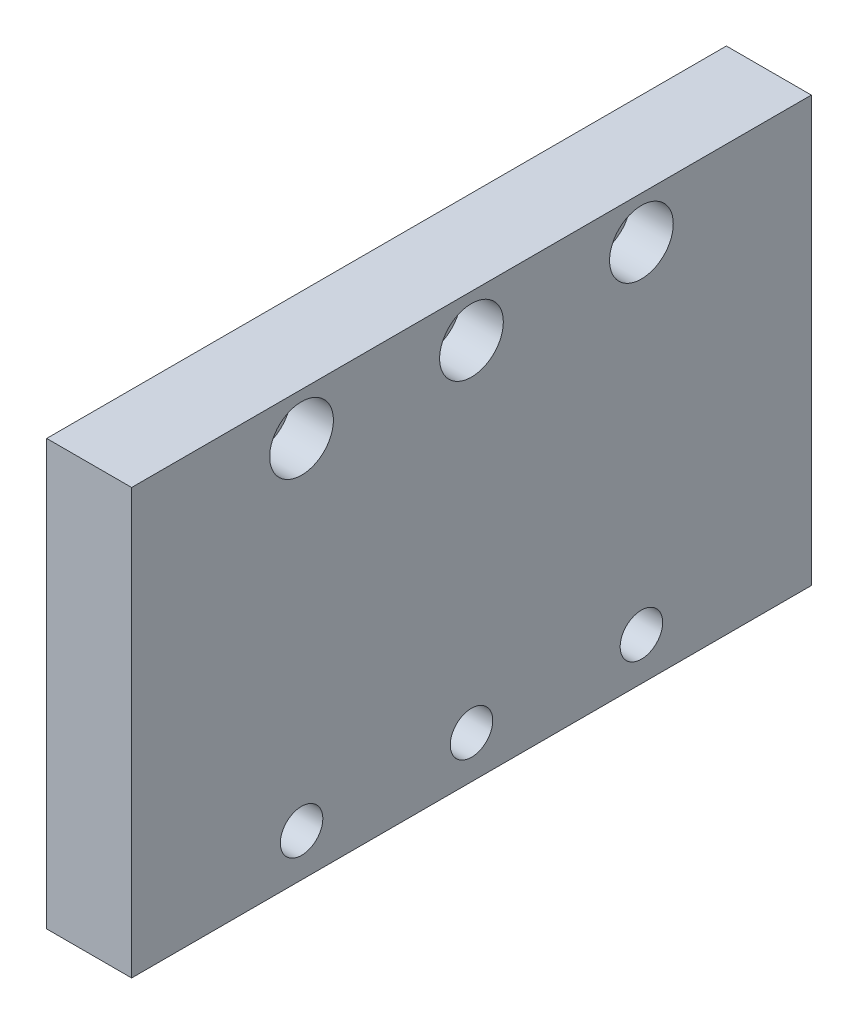
ISO-10303-21;
HEADER;
FILE_DESCRIPTION(('STEP AP214'),'2;1');
FILE_NAME('part.step','',(''),(''),'','','');
FILE_SCHEMA(('AUTOMOTIVE_DESIGN { 1 0 10303 214 1 1 1 1 }'));
ENDSEC;
DATA;
#1=APPLICATION_CONTEXT('core data for automotive mechanical design processes');
#2=APPLICATION_PROTOCOL_DEFINITION('international standard','automotive_design',2000,#1);
#3=PRODUCT_CONTEXT('',#1,'mechanical');
#4=PRODUCT('Part','Part','',(#3));
#5=PRODUCT_RELATED_PRODUCT_CATEGORY('part','',(#4));
#6=PRODUCT_DEFINITION_FORMATION('','',#4);
#7=PRODUCT_DEFINITION_CONTEXT('part definition',#1,'design');
#8=PRODUCT_DEFINITION('design','',#6,#7);
#9=PRODUCT_DEFINITION_SHAPE('','',#8);
#10=(LENGTH_UNIT() NAMED_UNIT(*) SI_UNIT(.MILLI.,.METRE.));
#11=(NAMED_UNIT(*) PLANE_ANGLE_UNIT() SI_UNIT($,.RADIAN.));
#12=(NAMED_UNIT(*) SI_UNIT($,.STERADIAN.) SOLID_ANGLE_UNIT());
#13=UNCERTAINTY_MEASURE_WITH_UNIT(LENGTH_MEASURE(1.E-05),#10,'distance_accuracy_value','');
#14=(GEOMETRIC_REPRESENTATION_CONTEXT(3) GLOBAL_UNCERTAINTY_ASSIGNED_CONTEXT((#13)) GLOBAL_UNIT_ASSIGNED_CONTEXT((#10,
#11,#12)) REPRESENTATION_CONTEXT('',''));
#15=CARTESIAN_POINT('',(0.,0.,0.));
#16=DIRECTION('',(0.,0.,1.));
#17=DIRECTION('',(1.,0.,0.));
#18=AXIS2_PLACEMENT_3D('',#15,#16,#17);
#19=CARTESIAN_POINT('',(-6.35,31.75,50.8));
#20=DIRECTION('',(0.,-1.,0.));
#21=DIRECTION('',(0.,0.,-1.));
#22=AXIS2_PLACEMENT_3D('',#19,#20,#21);
#23=PLANE('',#22);
#24=DIRECTION('',(-1.,0.,0.));
#25=VECTOR('',#24,1.);
#26=CARTESIAN_POINT('',(-6.35,31.75,-50.8));
#27=LINE('',#26,#25);
#28=CARTESIAN_POINT('',(6.35000000000004,31.75,-50.8));
#29=VERTEX_POINT('',#28);
#30=CARTESIAN_POINT('',(-6.35,31.75,-50.8));
#31=VERTEX_POINT('',#30);
#32=EDGE_CURVE('E87',#29,#31,#27,.T.);
#33=ORIENTED_EDGE('',*,*,#32,.T.);
#34=DIRECTION('',(0.,0.,-1.));
#35=VECTOR('',#34,1.);
#36=CARTESIAN_POINT('',(-6.35,31.75,50.8));
#37=LINE('',#36,#35);
#38=CARTESIAN_POINT('',(-6.35,31.75,50.8));
#39=VERTEX_POINT('',#38);
#40=EDGE_CURVE('E41',#39,#31,#37,.T.);
#41=ORIENTED_EDGE('',*,*,#40,.F.);
#42=DIRECTION('',(-1.,0.,0.));
#43=VECTOR('',#42,1.);
#44=CARTESIAN_POINT('',(-6.35,31.75,50.8));
#45=LINE('',#44,#43);
#46=CARTESIAN_POINT('',(6.35000000000004,31.75,50.8));
#47=VERTEX_POINT('',#46);
#48=EDGE_CURVE('E79',#47,#39,#45,.T.);
#49=ORIENTED_EDGE('',*,*,#48,.F.);
#50=DIRECTION('',(0.,0.,-1.));
#51=VECTOR('',#50,1.);
#52=CARTESIAN_POINT('',(6.35000000000004,31.75,50.8));
#53=LINE('',#52,#51);
#54=EDGE_CURVE('E11',#47,#29,#53,.T.);
#55=ORIENTED_EDGE('',*,*,#54,.T.);
#56=EDGE_LOOP('',(#33,#41,#49,#55));
#57=FACE_BOUND('',#56,.T.);
#58=ADVANCED_FACE('F33',(#57),#23,.F.);
#59=CARTESIAN_POINT('',(-6.35,19.05,50.8));
#60=DIRECTION('',(1.,0.,0.));
#61=DIRECTION('',(0.,1.,0.));
#62=AXIS2_PLACEMENT_3D('',#59,#60,#61);
#63=PLANE('',#62);
#64=CARTESIAN_POINT('',(-6.35000000000002,25.4,25.4));
#65=DIRECTION('',(1.,0.,0.));
#66=DIRECTION('',(0.,0.,-1.));
#67=AXIS2_PLACEMENT_3D('',#64,#65,#66);
#68=CIRCLE('',#67,3.175);
#69=CARTESIAN_POINT('',(-6.35000000000002,25.4,22.225));
#70=VERTEX_POINT('',#69);
#71=EDGE_CURVE('E131',#70,#70,#68,.T.);
#72=ORIENTED_EDGE('',*,*,#71,.T.);
#73=EDGE_LOOP('',(#72));
#74=FACE_BOUND('',#73,.T.);
#75=CARTESIAN_POINT('',(-6.35000000000002,25.4,0.));
#76=DIRECTION('',(1.,0.,0.));
#77=DIRECTION('',(0.,0.,-1.));
#78=AXIS2_PLACEMENT_3D('',#75,#76,#77);
#79=CIRCLE('',#78,3.175);
#80=CARTESIAN_POINT('',(-6.35000000000002,25.4,-3.175));
#81=VERTEX_POINT('',#80);
#82=EDGE_CURVE('E135',#81,#81,#79,.T.);
#83=ORIENTED_EDGE('',*,*,#82,.T.);
#84=EDGE_LOOP('',(#83));
#85=FACE_BOUND('',#84,.T.);
#86=CARTESIAN_POINT('',(-6.35000000000002,25.4,-25.4));
#87=DIRECTION('',(1.,0.,0.));
#88=DIRECTION('',(0.,0.,-1.));
#89=AXIS2_PLACEMENT_3D('',#86,#87,#88);
#90=CIRCLE('',#89,3.175);
#91=CARTESIAN_POINT('',(-6.35000000000002,25.4,-28.575));
#92=VERTEX_POINT('',#91);
#93=EDGE_CURVE('E139',#92,#92,#90,.T.);
#94=ORIENTED_EDGE('',*,*,#93,.T.);
#95=EDGE_LOOP('',(#94));
#96=FACE_BOUND('',#95,.T.);
#97=CARTESIAN_POINT('',(-6.35,-25.4,-25.4));
#98=DIRECTION('',(-1.,0.,0.));
#99=DIRECTION('',(0.,0.,1.));
#100=AXIS2_PLACEMENT_3D('',#97,#98,#99);
#101=CIRCLE('',#100,4.76249999999999);
#102=CARTESIAN_POINT('',(-6.35,-25.4,-20.6375));
#103=VERTEX_POINT('',#102);
#104=EDGE_CURVE('E143',#103,#103,#101,.T.);
#105=ORIENTED_EDGE('',*,*,#104,.F.);
#106=EDGE_LOOP('',(#105));
#107=FACE_BOUND('',#106,.T.);
#108=CARTESIAN_POINT('',(-6.35,-25.4,0.));
#109=DIRECTION('',(-1.,0.,0.));
#110=DIRECTION('',(0.,0.,1.));
#111=AXIS2_PLACEMENT_3D('',#108,#109,#110);
#112=CIRCLE('',#111,4.76249999999999);
#113=CARTESIAN_POINT('',(-6.35,-25.4,4.76249999999999));
#114=VERTEX_POINT('',#113);
#115=EDGE_CURVE('E147',#114,#114,#112,.T.);
#116=ORIENTED_EDGE('',*,*,#115,.F.);
#117=EDGE_LOOP('',(#116));
#118=FACE_BOUND('',#117,.T.);
#119=CARTESIAN_POINT('',(-6.35,-25.4,25.4));
#120=DIRECTION('',(-1.,0.,0.));
#121=DIRECTION('',(0.,0.,1.));
#122=AXIS2_PLACEMENT_3D('',#119,#120,#121);
#123=CIRCLE('',#122,4.76249999999999);
#124=CARTESIAN_POINT('',(-6.35,-25.4,30.1625));
#125=VERTEX_POINT('',#124);
#126=EDGE_CURVE('E150',#125,#125,#123,.T.);
#127=ORIENTED_EDGE('',*,*,#126,.F.);
#128=EDGE_LOOP('',(#127));
#129=FACE_BOUND('',#128,.T.);
#130=DIRECTION('',(0.,-1.,0.));
#131=VECTOR('',#130,1.);
#132=CARTESIAN_POINT('',(-6.35,19.05,-50.8));
#133=LINE('',#132,#131);
#134=CARTESIAN_POINT('',(-6.35,-31.75,-50.8));
#135=VERTEX_POINT('',#134);
#136=EDGE_CURVE('E66',#31,#135,#133,.T.);
#137=ORIENTED_EDGE('',*,*,#136,.T.);
#138=DIRECTION('',(0.,0.,-1.));
#139=VECTOR('',#138,1.);
#140=CARTESIAN_POINT('',(-6.35,-31.75,50.8));
#141=LINE('',#140,#139);
#142=CARTESIAN_POINT('',(-6.35,-31.75,50.8));
#143=VERTEX_POINT('',#142);
#144=EDGE_CURVE('E88',#143,#135,#141,.T.);
#145=ORIENTED_EDGE('',*,*,#144,.F.);
#146=DIRECTION('',(0.,-1.,0.));
#147=VECTOR('',#146,1.);
#148=CARTESIAN_POINT('',(-6.35,31.75,50.8));
#149=LINE('',#148,#147);
#150=EDGE_CURVE('E83',#39,#143,#149,.T.);
#151=ORIENTED_EDGE('',*,*,#150,.F.);
#152=ORIENTED_EDGE('',*,*,#40,.T.);
#153=EDGE_LOOP('',(#137,#145,#151,#152));
#154=FACE_BOUND('',#153,.T.);
#155=ADVANCED_FACE('F89',(#74,#85,#96,#107,#118,#129,#154),#63,.F.);
#156=CARTESIAN_POINT('',(-6.35,-31.75,50.8));
#157=DIRECTION('',(0.,1.,0.));
#158=DIRECTION('',(-1.,0.,0.));
#159=AXIS2_PLACEMENT_3D('',#156,#157,#158);
#160=PLANE('',#159);
#161=DIRECTION('',(1.,0.,0.));
#162=VECTOR('',#161,1.);
#163=CARTESIAN_POINT('',(-6.35,-31.75,-50.8));
#164=LINE('',#163,#162);
#165=CARTESIAN_POINT('',(6.35000000000005,-31.75,-50.8));
#166=VERTEX_POINT('',#165);
#167=EDGE_CURVE('E73',#135,#166,#164,.T.);
#168=ORIENTED_EDGE('',*,*,#167,.T.);
#169=DIRECTION('',(0.,0.,-1.));
#170=VECTOR('',#169,1.);
#171=CARTESIAN_POINT('',(6.35000000000005,-31.75,50.8));
#172=LINE('',#171,#170);
#173=CARTESIAN_POINT('',(6.35000000000005,-31.75,50.8));
#174=VERTEX_POINT('',#173);
#175=EDGE_CURVE('E93',#174,#166,#172,.T.);
#176=ORIENTED_EDGE('',*,*,#175,.F.);
#177=DIRECTION('',(1.,0.,0.));
#178=VECTOR('',#177,1.);
#179=CARTESIAN_POINT('',(-6.35,-31.75,50.8));
#180=LINE('',#179,#178);
#181=EDGE_CURVE('E91',#143,#174,#180,.T.);
#182=ORIENTED_EDGE('',*,*,#181,.F.);
#183=ORIENTED_EDGE('',*,*,#144,.T.);
#184=EDGE_LOOP('',(#168,#176,#182,#183));
#185=FACE_BOUND('',#184,.T.);
#186=ADVANCED_FACE('F104',(#185),#160,.F.);
#187=CARTESIAN_POINT('',(6.35000000000005,-19.0499999999999,50.8));
#188=DIRECTION('',(-1.,0.,0.));
#189=DIRECTION('',(0.,-1.,0.));
#190=AXIS2_PLACEMENT_3D('',#187,#188,#189);
#191=PLANE('',#190);
#192=CARTESIAN_POINT('',(6.35000000000004,25.4,25.4));
#193=DIRECTION('',(1.,0.,0.));
#194=DIRECTION('',(0.,0.,-1.));
#195=AXIS2_PLACEMENT_3D('',#192,#193,#194);
#196=CIRCLE('',#195,4.76249999999999);
#197=CARTESIAN_POINT('',(6.35000000000004,25.4,20.6375));
#198=VERTEX_POINT('',#197);
#199=EDGE_CURVE('E374',#198,#198,#196,.T.);
#200=ORIENTED_EDGE('',*,*,#199,.F.);
#201=EDGE_LOOP('',(#200));
#202=FACE_BOUND('',#201,.T.);
#203=CARTESIAN_POINT('',(6.35000000000004,25.4,0.));
#204=DIRECTION('',(1.,0.,0.));
#205=DIRECTION('',(0.,0.,-1.));
#206=AXIS2_PLACEMENT_3D('',#203,#204,#205);
#207=CIRCLE('',#206,4.76249999999999);
#208=CARTESIAN_POINT('',(6.35000000000004,25.4,-4.76249999999999));
#209=VERTEX_POINT('',#208);
#210=EDGE_CURVE('E382',#209,#209,#207,.T.);
#211=ORIENTED_EDGE('',*,*,#210,.F.);
#212=EDGE_LOOP('',(#211));
#213=FACE_BOUND('',#212,.T.);
#214=CARTESIAN_POINT('',(6.35000000000004,25.4,-25.4));
#215=DIRECTION('',(1.,0.,0.));
#216=DIRECTION('',(0.,0.,-1.));
#217=AXIS2_PLACEMENT_3D('',#214,#215,#216);
#218=CIRCLE('',#217,4.76249999999999);
#219=CARTESIAN_POINT('',(6.35000000000004,25.4,-30.1625));
#220=VERTEX_POINT('',#219);
#221=EDGE_CURVE('E392',#220,#220,#218,.T.);
#222=ORIENTED_EDGE('',*,*,#221,.F.);
#223=EDGE_LOOP('',(#222));
#224=FACE_BOUND('',#223,.T.);
#225=CARTESIAN_POINT('',(6.35000000000004,-25.4,-25.4));
#226=DIRECTION('',(-1.,0.,0.));
#227=DIRECTION('',(0.,0.,1.));
#228=AXIS2_PLACEMENT_3D('',#225,#226,#227);
#229=CIRCLE('',#228,3.175);
#230=CARTESIAN_POINT('',(6.35000000000004,-25.4,-22.225));
#231=VERTEX_POINT('',#230);
#232=EDGE_CURVE('E409',#231,#231,#229,.T.);
#233=ORIENTED_EDGE('',*,*,#232,.T.);
#234=EDGE_LOOP('',(#233));
#235=FACE_BOUND('',#234,.T.);
#236=CARTESIAN_POINT('',(6.35000000000004,-25.4,0.));
#237=DIRECTION('',(-1.,0.,0.));
#238=DIRECTION('',(0.,0.,1.));
#239=AXIS2_PLACEMENT_3D('',#236,#237,#238);
#240=CIRCLE('',#239,3.175);
#241=CARTESIAN_POINT('',(6.35000000000004,-25.4,3.175));
#242=VERTEX_POINT('',#241);
#243=EDGE_CURVE('E153',#242,#242,#240,.T.);
#244=ORIENTED_EDGE('',*,*,#243,.T.);
#245=EDGE_LOOP('',(#244));
#246=FACE_BOUND('',#245,.T.);
#247=CARTESIAN_POINT('',(6.35000000000004,-25.4,25.4));
#248=DIRECTION('',(-1.,0.,0.));
#249=DIRECTION('',(0.,0.,1.));
#250=AXIS2_PLACEMENT_3D('',#247,#248,#249);
#251=CIRCLE('',#250,3.175);
#252=CARTESIAN_POINT('',(6.35000000000004,-25.4,28.575));
#253=VERTEX_POINT('',#252);
#254=EDGE_CURVE('E98',#253,#253,#251,.T.);
#255=ORIENTED_EDGE('',*,*,#254,.T.);
#256=EDGE_LOOP('',(#255));
#257=FACE_BOUND('',#256,.T.);
#258=DIRECTION('',(0.,1.,0.));
#259=VECTOR('',#258,1.);
#260=CARTESIAN_POINT('',(6.35000000000005,-19.0499999999999,-50.8));
#261=LINE('',#260,#259);
#262=EDGE_CURVE('E101',#166,#29,#261,.T.);
#263=ORIENTED_EDGE('',*,*,#262,.T.);
#264=ORIENTED_EDGE('',*,*,#54,.F.);
#265=DIRECTION('',(0.,1.,0.));
#266=VECTOR('',#265,1.);
#267=CARTESIAN_POINT('',(6.35000000000004,31.75,50.8));
#268=LINE('',#267,#266);
#269=EDGE_CURVE('E49',#174,#47,#268,.T.);
#270=ORIENTED_EDGE('',*,*,#269,.F.);
#271=ORIENTED_EDGE('',*,*,#175,.T.);
#272=EDGE_LOOP('',(#263,#264,#270,#271));
#273=FACE_BOUND('',#272,.T.);
#274=ADVANCED_FACE('F108',(#202,#213,#224,#235,#246,#257,#273),#191,.F.);
#275=CARTESIAN_POINT('',(0.,0.,50.8));
#276=DIRECTION('',(0.,0.,1.));
#277=DIRECTION('',(1.,0.,0.));
#278=AXIS2_PLACEMENT_3D('',#275,#276,#277);
#279=PLANE('',#278);
#280=ORIENTED_EDGE('',*,*,#269,.T.);
#281=ORIENTED_EDGE('',*,*,#48,.T.);
#282=ORIENTED_EDGE('',*,*,#150,.T.);
#283=ORIENTED_EDGE('',*,*,#181,.T.);
#284=EDGE_LOOP('',(#280,#281,#282,#283));
#285=FACE_BOUND('',#284,.T.);
#286=ADVANCED_FACE('F81',(#285),#279,.T.);
#287=CARTESIAN_POINT('',(0.,0.,-50.8));
#288=DIRECTION('',(0.,0.,1.));
#289=DIRECTION('',(1.,0.,0.));
#290=AXIS2_PLACEMENT_3D('',#287,#288,#289);
#291=PLANE('',#290);
#292=ORIENTED_EDGE('',*,*,#32,.F.);
#293=ORIENTED_EDGE('',*,*,#262,.F.);
#294=ORIENTED_EDGE('',*,*,#167,.F.);
#295=ORIENTED_EDGE('',*,*,#136,.F.);
#296=EDGE_LOOP('',(#292,#293,#294,#295));
#297=FACE_BOUND('',#296,.T.);
#298=ADVANCED_FACE('F107',(#297),#291,.F.);
#299=CARTESIAN_POINT('',(-6.35,-25.4,25.4));
#300=DIRECTION('',(-1.,0.,0.));
#301=DIRECTION('',(0.,0.,1.));
#302=AXIS2_PLACEMENT_3D('',#299,#300,#301);
#303=CYLINDRICAL_SURFACE('',#302,3.17500000000001);
#304=ORIENTED_EDGE('',*,*,#254,.F.);
#305=EDGE_LOOP('',(#304));
#306=FACE_BOUND('',#305,.T.);
#307=CARTESIAN_POINT('',(0.,-25.4,25.4));
#308=DIRECTION('',(-1.,0.,0.));
#309=DIRECTION('',(0.,0.,1.));
#310=AXIS2_PLACEMENT_3D('',#307,#308,#309);
#311=CIRCLE('',#310,3.17500000000001);
#312=CARTESIAN_POINT('',(0.,-25.4,28.575));
#313=VERTEX_POINT('',#312);
#314=EDGE_CURVE('E156',#313,#313,#311,.T.);
#315=ORIENTED_EDGE('',*,*,#314,.T.);
#316=EDGE_LOOP('',(#315));
#317=FACE_BOUND('',#316,.T.);
#318=ADVANCED_FACE('F169',(#306,#317),#303,.F.);
#319=CARTESIAN_POINT('',(0.,-22.225,25.4));
#320=DIRECTION('',(1.,0.,0.));
#321=DIRECTION('',(0.,0.,-1.));
#322=AXIS2_PLACEMENT_3D('',#319,#320,#321);
#323=PLANE('',#322);
#324=ORIENTED_EDGE('',*,*,#314,.F.);
#325=EDGE_LOOP('',(#324));
#326=FACE_BOUND('',#325,.T.);
#327=CARTESIAN_POINT('',(0.,-25.4,25.4));
#328=DIRECTION('',(-1.,0.,0.));
#329=DIRECTION('',(0.,0.,1.));
#330=AXIS2_PLACEMENT_3D('',#327,#328,#329);
#331=CIRCLE('',#330,4.76249999999999);
#332=CARTESIAN_POINT('',(0.,-25.4,30.1625));
#333=VERTEX_POINT('',#332);
#334=EDGE_CURVE('E152',#333,#333,#331,.T.);
#335=ORIENTED_EDGE('',*,*,#334,.T.);
#336=EDGE_LOOP('',(#335));
#337=FACE_BOUND('',#336,.T.);
#338=ADVANCED_FACE('F172',(#326,#337),#323,.F.);
#339=CARTESIAN_POINT('',(-6.35,-25.4,25.4));
#340=DIRECTION('',(-1.,0.,0.));
#341=DIRECTION('',(0.,0.,1.));
#342=AXIS2_PLACEMENT_3D('',#339,#340,#341);
#343=CYLINDRICAL_SURFACE('',#342,4.76249999999999);
#344=ORIENTED_EDGE('',*,*,#334,.F.);
#345=EDGE_LOOP('',(#344));
#346=FACE_BOUND('',#345,.T.);
#347=ORIENTED_EDGE('',*,*,#126,.T.);
#348=EDGE_LOOP('',(#347));
#349=FACE_BOUND('',#348,.T.);
#350=ADVANCED_FACE('F178',(#346,#349),#343,.F.);
#351=CARTESIAN_POINT('',(-6.35,-25.4,0.));
#352=DIRECTION('',(-1.,0.,0.));
#353=DIRECTION('',(0.,0.,1.));
#354=AXIS2_PLACEMENT_3D('',#351,#352,#353);
#355=CYLINDRICAL_SURFACE('',#354,3.17500000000001);
#356=ORIENTED_EDGE('',*,*,#243,.F.);
#357=EDGE_LOOP('',(#356));
#358=FACE_BOUND('',#357,.T.);
#359=CARTESIAN_POINT('',(0.,-25.4,0.));
#360=DIRECTION('',(-1.,0.,0.));
#361=DIRECTION('',(0.,0.,1.));
#362=AXIS2_PLACEMENT_3D('',#359,#360,#361);
#363=CIRCLE('',#362,3.17500000000001);
#364=CARTESIAN_POINT('',(0.,-25.4,3.17500000000001));
#365=VERTEX_POINT('',#364);
#366=EDGE_CURVE('E159',#365,#365,#363,.T.);
#367=ORIENTED_EDGE('',*,*,#366,.T.);
#368=EDGE_LOOP('',(#367));
#369=FACE_BOUND('',#368,.T.);
#370=ADVANCED_FACE('F183',(#358,#369),#355,.F.);
#371=CARTESIAN_POINT('',(0.,-22.225,0.));
#372=DIRECTION('',(1.,0.,0.));
#373=DIRECTION('',(0.,0.,-1.));
#374=AXIS2_PLACEMENT_3D('',#371,#372,#373);
#375=PLANE('',#374);
#376=ORIENTED_EDGE('',*,*,#366,.F.);
#377=EDGE_LOOP('',(#376));
#378=FACE_BOUND('',#377,.T.);
#379=CARTESIAN_POINT('',(0.,-25.4,0.));
#380=DIRECTION('',(-1.,0.,0.));
#381=DIRECTION('',(0.,0.,1.));
#382=AXIS2_PLACEMENT_3D('',#379,#380,#381);
#383=CIRCLE('',#382,4.76249999999999);
#384=CARTESIAN_POINT('',(0.,-25.4,4.76249999999999));
#385=VERTEX_POINT('',#384);
#386=EDGE_CURVE('E413',#385,#385,#383,.T.);
#387=ORIENTED_EDGE('',*,*,#386,.T.);
#388=EDGE_LOOP('',(#387));
#389=FACE_BOUND('',#388,.T.);
#390=ADVANCED_FACE('F188',(#378,#389),#375,.F.);
#391=CARTESIAN_POINT('',(-6.35,-25.4,0.));
#392=DIRECTION('',(-1.,0.,0.));
#393=DIRECTION('',(0.,0.,1.));
#394=AXIS2_PLACEMENT_3D('',#391,#392,#393);
#395=CYLINDRICAL_SURFACE('',#394,4.76249999999999);
#396=ORIENTED_EDGE('',*,*,#386,.F.);
#397=EDGE_LOOP('',(#396));
#398=FACE_BOUND('',#397,.T.);
#399=ORIENTED_EDGE('',*,*,#115,.T.);
#400=EDGE_LOOP('',(#399));
#401=FACE_BOUND('',#400,.T.);
#402=ADVANCED_FACE('F224',(#398,#401),#395,.F.);
#403=CARTESIAN_POINT('',(-6.35,-25.4,-25.4));
#404=DIRECTION('',(-1.,0.,0.));
#405=DIRECTION('',(0.,0.,1.));
#406=AXIS2_PLACEMENT_3D('',#403,#404,#405);
#407=CYLINDRICAL_SURFACE('',#406,3.17500000000001);
#408=ORIENTED_EDGE('',*,*,#232,.F.);
#409=EDGE_LOOP('',(#408));
#410=FACE_BOUND('',#409,.T.);
#411=CARTESIAN_POINT('',(0.,-25.4,-25.4));
#412=DIRECTION('',(-1.,0.,0.));
#413=DIRECTION('',(0.,0.,1.));
#414=AXIS2_PLACEMENT_3D('',#411,#412,#413);
#415=CIRCLE('',#414,3.17500000000001);
#416=CARTESIAN_POINT('',(0.,-25.4,-22.225));
#417=VERTEX_POINT('',#416);
#418=EDGE_CURVE('E406',#417,#417,#415,.T.);
#419=ORIENTED_EDGE('',*,*,#418,.T.);
#420=EDGE_LOOP('',(#419));
#421=FACE_BOUND('',#420,.T.);
#422=ADVANCED_FACE('F233',(#410,#421),#407,.F.);
#423=CARTESIAN_POINT('',(0.,-22.225,-25.4));
#424=DIRECTION('',(1.,0.,0.));
#425=DIRECTION('',(0.,0.,-1.));
#426=AXIS2_PLACEMENT_3D('',#423,#424,#425);
#427=PLANE('',#426);
#428=ORIENTED_EDGE('',*,*,#418,.F.);
#429=EDGE_LOOP('',(#428));
#430=FACE_BOUND('',#429,.T.);
#431=CARTESIAN_POINT('',(0.,-25.4,-25.4));
#432=DIRECTION('',(-1.,0.,0.));
#433=DIRECTION('',(0.,0.,1.));
#434=AXIS2_PLACEMENT_3D('',#431,#432,#433);
#435=CIRCLE('',#434,4.76249999999999);
#436=CARTESIAN_POINT('',(0.,-25.4,-20.6375));
#437=VERTEX_POINT('',#436);
#438=EDGE_CURVE('E403',#437,#437,#435,.T.);
#439=ORIENTED_EDGE('',*,*,#438,.T.);
#440=EDGE_LOOP('',(#439));
#441=FACE_BOUND('',#440,.T.);
#442=ADVANCED_FACE('F243',(#430,#441),#427,.F.);
#443=CARTESIAN_POINT('',(-6.35,-25.4,-25.4));
#444=DIRECTION('',(-1.,0.,0.));
#445=DIRECTION('',(0.,0.,1.));
#446=AXIS2_PLACEMENT_3D('',#443,#444,#445);
#447=CYLINDRICAL_SURFACE('',#446,4.76249999999999);
#448=ORIENTED_EDGE('',*,*,#438,.F.);
#449=EDGE_LOOP('',(#448));
#450=FACE_BOUND('',#449,.T.);
#451=ORIENTED_EDGE('',*,*,#104,.T.);
#452=EDGE_LOOP('',(#451));
#453=FACE_BOUND('',#452,.T.);
#454=ADVANCED_FACE('F253',(#450,#453),#447,.F.);
#455=CARTESIAN_POINT('',(6.35000000000004,25.4,-25.4));
#456=DIRECTION('',(1.,0.,0.));
#457=DIRECTION('',(0.,0.,-1.));
#458=AXIS2_PLACEMENT_3D('',#455,#456,#457);
#459=CYLINDRICAL_SURFACE('',#458,3.175);
#460=ORIENTED_EDGE('',*,*,#93,.F.);
#461=EDGE_LOOP('',(#460));
#462=FACE_BOUND('',#461,.T.);
#463=CARTESIAN_POINT('',(0.,25.4,-25.4));
#464=DIRECTION('',(1.,0.,0.));
#465=DIRECTION('',(0.,0.,-1.));
#466=AXIS2_PLACEMENT_3D('',#463,#464,#465);
#467=CIRCLE('',#466,3.175);
#468=CARTESIAN_POINT('',(0.,25.4,-28.575));
#469=VERTEX_POINT('',#468);
#470=EDGE_CURVE('E398',#469,#469,#467,.T.);
#471=ORIENTED_EDGE('',*,*,#470,.T.);
#472=EDGE_LOOP('',(#471));
#473=FACE_BOUND('',#472,.T.);
#474=ADVANCED_FACE('F262',(#462,#473),#459,.F.);
#475=CARTESIAN_POINT('',(0.,28.575,-25.4));
#476=DIRECTION('',(-1.,0.,0.));
#477=DIRECTION('',(0.,0.,1.));
#478=AXIS2_PLACEMENT_3D('',#475,#476,#477);
#479=PLANE('',#478);
#480=ORIENTED_EDGE('',*,*,#470,.F.);
#481=EDGE_LOOP('',(#480));
#482=FACE_BOUND('',#481,.T.);
#483=CARTESIAN_POINT('',(0.,25.4,-25.4));
#484=DIRECTION('',(1.,0.,0.));
#485=DIRECTION('',(0.,0.,-1.));
#486=AXIS2_PLACEMENT_3D('',#483,#484,#485);
#487=CIRCLE('',#486,4.7625);
#488=CARTESIAN_POINT('',(0.,25.4,-30.1625));
#489=VERTEX_POINT('',#488);
#490=EDGE_CURVE('E395',#489,#489,#487,.T.);
#491=ORIENTED_EDGE('',*,*,#490,.T.);
#492=EDGE_LOOP('',(#491));
#493=FACE_BOUND('',#492,.T.);
#494=ADVANCED_FACE('F285',(#482,#493),#479,.F.);
#495=CARTESIAN_POINT('',(6.35000000000004,25.4,-25.4));
#496=DIRECTION('',(1.,0.,0.));
#497=DIRECTION('',(0.,0.,-1.));
#498=AXIS2_PLACEMENT_3D('',#495,#496,#497);
#499=CYLINDRICAL_SURFACE('',#498,4.76249999999999);
#500=ORIENTED_EDGE('',*,*,#490,.F.);
#501=EDGE_LOOP('',(#500));
#502=FACE_BOUND('',#501,.T.);
#503=ORIENTED_EDGE('',*,*,#221,.T.);
#504=EDGE_LOOP('',(#503));
#505=FACE_BOUND('',#504,.T.);
#506=ADVANCED_FACE('F295',(#502,#505),#499,.F.);
#507=CARTESIAN_POINT('',(6.35000000000004,25.4,0.));
#508=DIRECTION('',(1.,0.,0.));
#509=DIRECTION('',(0.,0.,-1.));
#510=AXIS2_PLACEMENT_3D('',#507,#508,#509);
#511=CYLINDRICAL_SURFACE('',#510,3.175);
#512=ORIENTED_EDGE('',*,*,#82,.F.);
#513=EDGE_LOOP('',(#512));
#514=FACE_BOUND('',#513,.T.);
#515=CARTESIAN_POINT('',(0.,25.4,0.));
#516=DIRECTION('',(1.,0.,0.));
#517=DIRECTION('',(0.,0.,-1.));
#518=AXIS2_PLACEMENT_3D('',#515,#516,#517);
#519=CIRCLE('',#518,3.175);
#520=CARTESIAN_POINT('',(0.,25.4,-3.175));
#521=VERTEX_POINT('',#520);
#522=EDGE_CURVE('E388',#521,#521,#519,.T.);
#523=ORIENTED_EDGE('',*,*,#522,.T.);
#524=EDGE_LOOP('',(#523));
#525=FACE_BOUND('',#524,.T.);
#526=ADVANCED_FACE('F305',(#514,#525),#511,.F.);
#527=CARTESIAN_POINT('',(0.,28.575,0.));
#528=DIRECTION('',(-1.,0.,0.));
#529=DIRECTION('',(0.,0.,1.));
#530=AXIS2_PLACEMENT_3D('',#527,#528,#529);
#531=PLANE('',#530);
#532=ORIENTED_EDGE('',*,*,#522,.F.);
#533=EDGE_LOOP('',(#532));
#534=FACE_BOUND('',#533,.T.);
#535=CARTESIAN_POINT('',(0.,25.4,0.));
#536=DIRECTION('',(1.,0.,0.));
#537=DIRECTION('',(0.,0.,-1.));
#538=AXIS2_PLACEMENT_3D('',#535,#536,#537);
#539=CIRCLE('',#538,4.7625);
#540=CARTESIAN_POINT('',(0.,25.4,-4.7625));
#541=VERTEX_POINT('',#540);
#542=EDGE_CURVE('E385',#541,#541,#539,.T.);
#543=ORIENTED_EDGE('',*,*,#542,.T.);
#544=EDGE_LOOP('',(#543));
#545=FACE_BOUND('',#544,.T.);
#546=ADVANCED_FACE('F315',(#534,#545),#531,.F.);
#547=CARTESIAN_POINT('',(6.35000000000004,25.4,0.));
#548=DIRECTION('',(1.,0.,0.));
#549=DIRECTION('',(0.,0.,-1.));
#550=AXIS2_PLACEMENT_3D('',#547,#548,#549);
#551=CYLINDRICAL_SURFACE('',#550,4.76249999999999);
#552=ORIENTED_EDGE('',*,*,#542,.F.);
#553=EDGE_LOOP('',(#552));
#554=FACE_BOUND('',#553,.T.);
#555=ORIENTED_EDGE('',*,*,#210,.T.);
#556=EDGE_LOOP('',(#555));
#557=FACE_BOUND('',#556,.T.);
#558=ADVANCED_FACE('F325',(#554,#557),#551,.F.);
#559=CARTESIAN_POINT('',(6.35000000000004,25.4,25.4));
#560=DIRECTION('',(1.,0.,0.));
#561=DIRECTION('',(0.,0.,-1.));
#562=AXIS2_PLACEMENT_3D('',#559,#560,#561);
#563=CYLINDRICAL_SURFACE('',#562,3.175);
#564=ORIENTED_EDGE('',*,*,#71,.F.);
#565=EDGE_LOOP('',(#564));
#566=FACE_BOUND('',#565,.T.);
#567=CARTESIAN_POINT('',(0.,25.4,25.4));
#568=DIRECTION('',(1.,0.,0.));
#569=DIRECTION('',(0.,0.,-1.));
#570=AXIS2_PLACEMENT_3D('',#567,#568,#569);
#571=CIRCLE('',#570,3.175);
#572=CARTESIAN_POINT('',(0.,25.4,22.225));
#573=VERTEX_POINT('',#572);
#574=EDGE_CURVE('E376',#573,#573,#571,.T.);
#575=ORIENTED_EDGE('',*,*,#574,.T.);
#576=EDGE_LOOP('',(#575));
#577=FACE_BOUND('',#576,.T.);
#578=ADVANCED_FACE('F335',(#566,#577),#563,.F.);
#579=CARTESIAN_POINT('',(0.,28.575,25.4));
#580=DIRECTION('',(-1.,0.,0.));
#581=DIRECTION('',(0.,0.,1.));
#582=AXIS2_PLACEMENT_3D('',#579,#580,#581);
#583=PLANE('',#582);
#584=ORIENTED_EDGE('',*,*,#574,.F.);
#585=EDGE_LOOP('',(#584));
#586=FACE_BOUND('',#585,.T.);
#587=CARTESIAN_POINT('',(0.,25.4,25.4));
#588=DIRECTION('',(1.,0.,0.));
#589=DIRECTION('',(0.,0.,-1.));
#590=AXIS2_PLACEMENT_3D('',#587,#588,#589);
#591=CIRCLE('',#590,4.7625);
#592=CARTESIAN_POINT('',(0.,25.4,20.6375));
#593=VERTEX_POINT('',#592);
#594=EDGE_CURVE('E372',#593,#593,#591,.T.);
#595=ORIENTED_EDGE('',*,*,#594,.T.);
#596=EDGE_LOOP('',(#595));
#597=FACE_BOUND('',#596,.T.);
#598=ADVANCED_FACE('F345',(#586,#597),#583,.F.);
#599=CARTESIAN_POINT('',(6.35000000000004,25.4,25.4));
#600=DIRECTION('',(1.,0.,0.));
#601=DIRECTION('',(0.,0.,-1.));
#602=AXIS2_PLACEMENT_3D('',#599,#600,#601);
#603=CYLINDRICAL_SURFACE('',#602,4.76249999999999);
#604=ORIENTED_EDGE('',*,*,#594,.F.);
#605=EDGE_LOOP('',(#604));
#606=FACE_BOUND('',#605,.T.);
#607=ORIENTED_EDGE('',*,*,#199,.T.);
#608=EDGE_LOOP('',(#607));
#609=FACE_BOUND('',#608,.T.);
#610=ADVANCED_FACE('F355',(#606,#609),#603,.F.);
#611=CLOSED_SHELL('',(#58,#155,#186,#274,#286,#298,#318,#338,#350,#370,#390,#402,#422,#442,#454,
#474,#494,#506,#526,#546,#558,#578,#598,#610));
#612=MANIFOLD_SOLID_BREP('B2',#611);
#613=ADVANCED_BREP_SHAPE_REPRESENTATION('',(#18,#612),#14);
#614=SHAPE_DEFINITION_REPRESENTATION(#9,#613);
ENDSEC;
END-ISO-10303-21;
